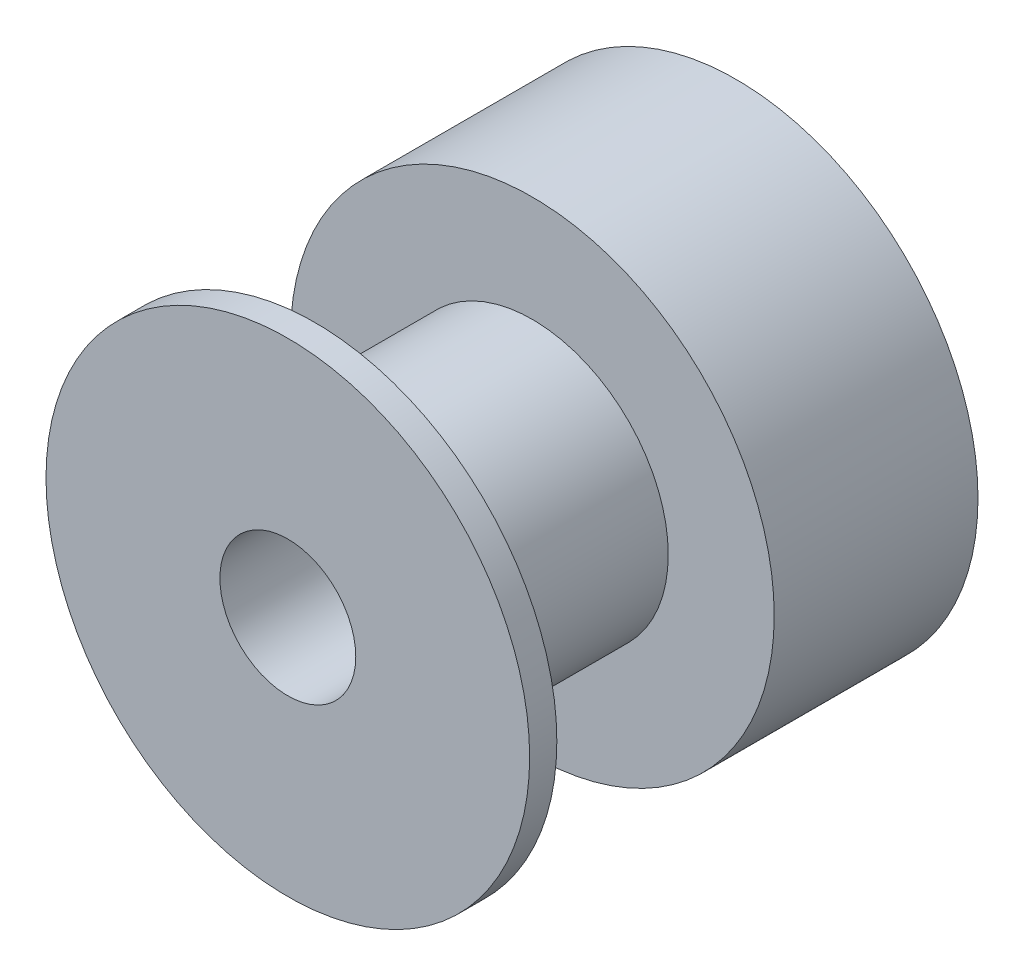
ISO-10303-21;
HEADER;
FILE_DESCRIPTION(('STEP AP214'),'2;1');
FILE_NAME('part.step','',(''),(''),'','','');
FILE_SCHEMA(('AUTOMOTIVE_DESIGN { 1 0 10303 214 1 1 1 1 }'));
ENDSEC;
DATA;
#1=APPLICATION_CONTEXT('core data for automotive mechanical design processes');
#2=APPLICATION_PROTOCOL_DEFINITION('international standard','automotive_design',2000,#1);
#3=PRODUCT_CONTEXT('',#1,'mechanical');
#4=PRODUCT('Part','Part','',(#3));
#5=PRODUCT_RELATED_PRODUCT_CATEGORY('part','',(#4));
#6=PRODUCT_DEFINITION_FORMATION('','',#4);
#7=PRODUCT_DEFINITION_CONTEXT('part definition',#1,'design');
#8=PRODUCT_DEFINITION('design','',#6,#7);
#9=PRODUCT_DEFINITION_SHAPE('','',#8);
#10=(LENGTH_UNIT() NAMED_UNIT(*) SI_UNIT(.MILLI.,.METRE.));
#11=(NAMED_UNIT(*) PLANE_ANGLE_UNIT() SI_UNIT($,.RADIAN.));
#12=(NAMED_UNIT(*) SI_UNIT($,.STERADIAN.) SOLID_ANGLE_UNIT());
#13=UNCERTAINTY_MEASURE_WITH_UNIT(LENGTH_MEASURE(1.E-05),#10,'distance_accuracy_value','');
#14=(GEOMETRIC_REPRESENTATION_CONTEXT(3) GLOBAL_UNCERTAINTY_ASSIGNED_CONTEXT((#13)) GLOBAL_UNIT_ASSIGNED_CONTEXT((#10,
#11,#12)) REPRESENTATION_CONTEXT('',''));
#15=CARTESIAN_POINT('',(0.,0.,0.));
#16=DIRECTION('',(0.,0.,1.));
#17=DIRECTION('',(1.,0.,0.));
#18=AXIS2_PLACEMENT_3D('',#15,#16,#17);
#19=CARTESIAN_POINT('',(0.,0.,16.5));
#20=DIRECTION('',(0.,0.,-1.));
#21=DIRECTION('',(-1.,0.,0.));
#22=AXIS2_PLACEMENT_3D('',#19,#20,#21);
#23=CYLINDRICAL_SURFACE('',#22,8.9);
#24=CARTESIAN_POINT('',(0.,0.,0.));
#25=DIRECTION('',(0.,0.,1.));
#26=DIRECTION('',(1.,0.,0.));
#27=AXIS2_PLACEMENT_3D('',#24,#25,#26);
#28=CIRCLE('',#27,8.9);
#29=CARTESIAN_POINT('',(8.9,0.,0.));
#30=VERTEX_POINT('',#29);
#31=EDGE_CURVE('E35',#30,#30,#28,.T.);
#32=ORIENTED_EDGE('',*,*,#31,.T.);
#33=EDGE_LOOP('',(#32));
#34=FACE_BOUND('',#33,.T.);
#35=CARTESIAN_POINT('',(0.,0.,7.5));
#36=DIRECTION('',(0.,0.,1.));
#37=DIRECTION('',(1.,0.,0.));
#38=AXIS2_PLACEMENT_3D('',#35,#36,#37);
#39=CIRCLE('',#38,8.9);
#40=CARTESIAN_POINT('',(8.9,0.,7.5));
#41=VERTEX_POINT('',#40);
#42=EDGE_CURVE('E47',#41,#41,#39,.T.);
#43=ORIENTED_EDGE('',*,*,#42,.F.);
#44=EDGE_LOOP('',(#43));
#45=FACE_BOUND('',#44,.T.);
#46=ADVANCED_FACE('F31',(#34,#45),#23,.T.);
#47=CARTESIAN_POINT('',(0.,0.,16.5));
#48=DIRECTION('',(0.,0.,1.));
#49=DIRECTION('',(1.,0.,0.));
#50=AXIS2_PLACEMENT_3D('',#47,#48,#49);
#51=PLANE('',#50);
#52=CARTESIAN_POINT('',(0.,0.,16.5));
#53=DIRECTION('',(0.,0.,1.));
#54=DIRECTION('',(1.,0.,0.));
#55=AXIS2_PLACEMENT_3D('',#52,#53,#54);
#56=CIRCLE('',#55,8.9);
#57=CARTESIAN_POINT('',(8.9,0.,16.5));
#58=VERTEX_POINT('',#57);
#59=EDGE_CURVE('E10',#58,#58,#56,.T.);
#60=ORIENTED_EDGE('',*,*,#59,.T.);
#61=EDGE_LOOP('',(#60));
#62=FACE_BOUND('',#61,.T.);
#63=CARTESIAN_POINT('',(0.,0.,16.5));
#64=DIRECTION('',(0.,0.,1.));
#65=DIRECTION('',(1.,0.,0.));
#66=AXIS2_PLACEMENT_3D('',#63,#64,#65);
#67=CIRCLE('',#66,2.5);
#68=CARTESIAN_POINT('',(2.5,0.,16.5));
#69=VERTEX_POINT('',#68);
#70=EDGE_CURVE('E42',#69,#69,#67,.T.);
#71=ORIENTED_EDGE('',*,*,#70,.F.);
#72=EDGE_LOOP('',(#71));
#73=FACE_BOUND('',#72,.T.);
#74=ADVANCED_FACE('F74',(#62,#73),#51,.T.);
#75=CARTESIAN_POINT('',(0.,0.,0.));
#76=DIRECTION('',(0.,0.,1.));
#77=DIRECTION('',(1.,0.,0.));
#78=AXIS2_PLACEMENT_3D('',#75,#76,#77);
#79=PLANE('',#78);
#80=ORIENTED_EDGE('',*,*,#31,.F.);
#81=EDGE_LOOP('',(#80));
#82=FACE_BOUND('',#81,.T.);
#83=CARTESIAN_POINT('',(0.,0.,0.));
#84=DIRECTION('',(0.,0.,1.));
#85=DIRECTION('',(1.,0.,0.));
#86=AXIS2_PLACEMENT_3D('',#83,#84,#85);
#87=CIRCLE('',#86,2.5);
#88=CARTESIAN_POINT('',(2.5,0.,0.));
#89=VERTEX_POINT('',#88);
#90=EDGE_CURVE('E44',#89,#89,#87,.T.);
#91=ORIENTED_EDGE('',*,*,#90,.T.);
#92=EDGE_LOOP('',(#91));
#93=FACE_BOUND('',#92,.T.);
#94=ADVANCED_FACE('F79',(#82,#93),#79,.F.);
#95=CARTESIAN_POINT('',(0.,0.,15.5));
#96=DIRECTION('',(0.,0.,1.));
#97=DIRECTION('',(1.,0.,0.));
#98=AXIS2_PLACEMENT_3D('',#95,#96,#97);
#99=CIRCLE('',#98,8.9);
#100=CARTESIAN_POINT('',(8.9,0.,15.5));
#101=VERTEX_POINT('',#100);
#102=EDGE_CURVE('E50',#101,#101,#99,.T.);
#103=ORIENTED_EDGE('',*,*,#102,.T.);
#104=EDGE_LOOP('',(#103));
#105=FACE_BOUND('',#104,.T.);
#106=ORIENTED_EDGE('',*,*,#59,.F.);
#107=EDGE_LOOP('',(#106));
#108=FACE_BOUND('',#107,.T.);
#109=ADVANCED_FACE('F33',(#105,#108),#23,.T.);
#110=CARTESIAN_POINT('',(0.,0.,16.5));
#111=DIRECTION('',(0.,0.,-1.));
#112=DIRECTION('',(-1.,0.,0.));
#113=AXIS2_PLACEMENT_3D('',#110,#111,#112);
#114=CYLINDRICAL_SURFACE('',#113,2.5);
#115=ORIENTED_EDGE('',*,*,#70,.T.);
#116=EDGE_LOOP('',(#115));
#117=FACE_BOUND('',#116,.T.);
#118=ORIENTED_EDGE('',*,*,#90,.F.);
#119=EDGE_LOOP('',(#118));
#120=FACE_BOUND('',#119,.T.);
#121=ADVANCED_FACE('F69',(#117,#120),#114,.F.);
#122=CARTESIAN_POINT('',(0.,0.,7.5));
#123=DIRECTION('',(0.,0.,1.));
#124=DIRECTION('',(1.,0.,0.));
#125=AXIS2_PLACEMENT_3D('',#122,#123,#124);
#126=PLANE('',#125);
#127=CARTESIAN_POINT('',(0.,0.,7.5));
#128=DIRECTION('',(0.,0.,1.));
#129=DIRECTION('',(1.,0.,0.));
#130=AXIS2_PLACEMENT_3D('',#127,#128,#129);
#131=CIRCLE('',#130,5.);
#132=CARTESIAN_POINT('',(5.,0.,7.5));
#133=VERTEX_POINT('',#132);
#134=EDGE_CURVE('E53',#133,#133,#131,.T.);
#135=ORIENTED_EDGE('',*,*,#134,.F.);
#136=EDGE_LOOP('',(#135));
#137=FACE_BOUND('',#136,.T.);
#138=ORIENTED_EDGE('',*,*,#42,.T.);
#139=EDGE_LOOP('',(#138));
#140=FACE_BOUND('',#139,.T.);
#141=ADVANCED_FACE('F65',(#137,#140),#126,.T.);
#142=CARTESIAN_POINT('',(0.,0.,15.5));
#143=DIRECTION('',(0.,0.,1.));
#144=DIRECTION('',(1.,0.,0.));
#145=AXIS2_PLACEMENT_3D('',#142,#143,#144);
#146=PLANE('',#145);
#147=CARTESIAN_POINT('',(0.,0.,15.5));
#148=DIRECTION('',(0.,0.,1.));
#149=DIRECTION('',(1.,0.,0.));
#150=AXIS2_PLACEMENT_3D('',#147,#148,#149);
#151=CIRCLE('',#150,5.);
#152=CARTESIAN_POINT('',(5.,0.,15.5));
#153=VERTEX_POINT('',#152);
#154=EDGE_CURVE('E56',#153,#153,#151,.T.);
#155=ORIENTED_EDGE('',*,*,#154,.T.);
#156=EDGE_LOOP('',(#155));
#157=FACE_BOUND('',#156,.T.);
#158=ORIENTED_EDGE('',*,*,#102,.F.);
#159=EDGE_LOOP('',(#158));
#160=FACE_BOUND('',#159,.T.);
#161=ADVANCED_FACE('F68',(#157,#160),#146,.F.);
#162=CARTESIAN_POINT('',(0.,0.,7.5));
#163=DIRECTION('',(0.,0.,1.));
#164=DIRECTION('',(1.,0.,0.));
#165=AXIS2_PLACEMENT_3D('',#162,#163,#164);
#166=CYLINDRICAL_SURFACE('',#165,5.);
#167=ORIENTED_EDGE('',*,*,#134,.T.);
#168=EDGE_LOOP('',(#167));
#169=FACE_BOUND('',#168,.T.);
#170=ORIENTED_EDGE('',*,*,#154,.F.);
#171=EDGE_LOOP('',(#170));
#172=FACE_BOUND('',#171,.T.);
#173=ADVANCED_FACE('F62',(#169,#172),#166,.T.);
#174=CLOSED_SHELL('',(#46,#74,#94,#109,#121,#141,#161,#173));
#175=MANIFOLD_SOLID_BREP('B2',#174);
#176=ADVANCED_BREP_SHAPE_REPRESENTATION('',(#18,#175),#14);
#177=SHAPE_DEFINITION_REPRESENTATION(#9,#176);
ENDSEC;
END-ISO-10303-21;
